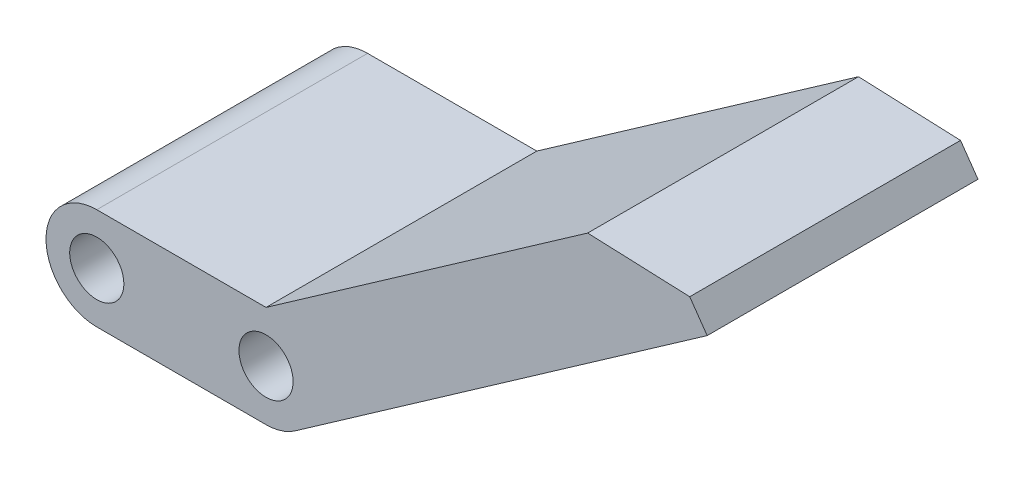
ISO-10303-21;
HEADER;
FILE_DESCRIPTION(('STEP AP214'),'2;1');
FILE_NAME('part.step','',(''),(''),'','','');
FILE_SCHEMA(('AUTOMOTIVE_DESIGN { 1 0 10303 214 1 1 1 1 }'));
ENDSEC;
DATA;
#1=APPLICATION_CONTEXT('core data for automotive mechanical design processes');
#2=APPLICATION_PROTOCOL_DEFINITION('international standard','automotive_design',2000,#1);
#3=PRODUCT_CONTEXT('',#1,'mechanical');
#4=PRODUCT('Part','Part','',(#3));
#5=PRODUCT_RELATED_PRODUCT_CATEGORY('part','',(#4));
#6=PRODUCT_DEFINITION_FORMATION('','',#4);
#7=PRODUCT_DEFINITION_CONTEXT('part definition',#1,'design');
#8=PRODUCT_DEFINITION('design','',#6,#7);
#9=PRODUCT_DEFINITION_SHAPE('','',#8);
#10=(LENGTH_UNIT() NAMED_UNIT(*) SI_UNIT(.MILLI.,.METRE.));
#11=(NAMED_UNIT(*) PLANE_ANGLE_UNIT() SI_UNIT($,.RADIAN.));
#12=(NAMED_UNIT(*) SI_UNIT($,.STERADIAN.) SOLID_ANGLE_UNIT());
#13=UNCERTAINTY_MEASURE_WITH_UNIT(LENGTH_MEASURE(1.E-05),#10,'distance_accuracy_value','');
#14=(GEOMETRIC_REPRESENTATION_CONTEXT(3) GLOBAL_UNCERTAINTY_ASSIGNED_CONTEXT((#13)) GLOBAL_UNIT_ASSIGNED_CONTEXT((#10,
#11,#12)) REPRESENTATION_CONTEXT('',''));
#15=CARTESIAN_POINT('',(0.,0.,0.));
#16=DIRECTION('',(0.,0.,1.));
#17=DIRECTION('',(1.,0.,0.));
#18=AXIS2_PLACEMENT_3D('',#15,#16,#17);
#19=CARTESIAN_POINT('',(0.,-7.5,40.));
#20=DIRECTION('',(0.,1.,0.));
#21=DIRECTION('',(-1.,0.,0.));
#22=AXIS2_PLACEMENT_3D('',#19,#20,#21);
#23=PLANE('',#22);
#24=DIRECTION('',(1.,0.,0.));
#25=VECTOR('',#24,1.);
#26=CARTESIAN_POINT('',(0.,-7.5,0.));
#27=LINE('',#26,#25);
#28=CARTESIAN_POINT('',(0.,-7.5,0.));
#29=VERTEX_POINT('',#28);
#30=CARTESIAN_POINT('',(25.,-7.5,0.));
#31=VERTEX_POINT('',#30);
#32=EDGE_CURVE('E143',#29,#31,#27,.T.);
#33=ORIENTED_EDGE('',*,*,#32,.T.);
#34=DIRECTION('',(0.,0.,-1.));
#35=VECTOR('',#34,1.);
#36=CARTESIAN_POINT('',(25.,-7.5,40.));
#37=LINE('',#36,#35);
#38=CARTESIAN_POINT('',(25.,-7.5,40.));
#39=VERTEX_POINT('',#38);
#40=EDGE_CURVE('E11',#39,#31,#37,.T.);
#41=ORIENTED_EDGE('',*,*,#40,.F.);
#42=DIRECTION('',(1.,0.,0.));
#43=VECTOR('',#42,1.);
#44=CARTESIAN_POINT('',(0.,-7.5,40.));
#45=LINE('',#44,#43);
#46=CARTESIAN_POINT('',(0.,-7.5,40.));
#47=VERTEX_POINT('',#46);
#48=EDGE_CURVE('E188',#47,#39,#45,.T.);
#49=ORIENTED_EDGE('',*,*,#48,.F.);
#50=DIRECTION('',(0.,0.,-1.));
#51=VECTOR('',#50,1.);
#52=CARTESIAN_POINT('',(0.,-7.5,40.));
#53=LINE('',#52,#51);
#54=EDGE_CURVE('E133',#47,#29,#53,.T.);
#55=ORIENTED_EDGE('',*,*,#54,.T.);
#56=EDGE_LOOP('',(#33,#41,#49,#55));
#57=FACE_BOUND('',#56,.T.);
#58=ADVANCED_FACE('F41',(#57),#23,.F.);
#59=CARTESIAN_POINT('',(25.,0.,40.));
#60=DIRECTION('',(0.,0.,-1.));
#61=DIRECTION('',(-1.,0.,0.));
#62=AXIS2_PLACEMENT_3D('',#59,#60,#61);
#63=CYLINDRICAL_SURFACE('',#62,7.5);
#64=CARTESIAN_POINT('',(25.,0.,0.));
#65=DIRECTION('',(0.,0.,1.));
#66=DIRECTION('',(1.,0.,0.));
#67=AXIS2_PLACEMENT_3D('',#64,#65,#66);
#68=CIRCLE('',#67,7.5);
#69=CARTESIAN_POINT('',(29.3018232726329,-6.14364033216744,0.));
#70=VERTEX_POINT('',#69);
#71=EDGE_CURVE('E146',#31,#70,#68,.T.);
#72=ORIENTED_EDGE('',*,*,#71,.T.);
#73=DIRECTION('',(0.,0.,-1.));
#74=VECTOR('',#73,1.);
#75=CARTESIAN_POINT('',(29.3018232726329,-6.14364033216744,40.));
#76=LINE('',#75,#74);
#77=CARTESIAN_POINT('',(29.3018232726329,-6.14364033216744,40.));
#78=VERTEX_POINT('',#77);
#79=EDGE_CURVE('E50',#78,#70,#76,.T.);
#80=ORIENTED_EDGE('',*,*,#79,.F.);
#81=CARTESIAN_POINT('',(25.,0.,40.));
#82=DIRECTION('',(0.,0.,1.));
#83=DIRECTION('',(1.,0.,0.));
#84=AXIS2_PLACEMENT_3D('',#81,#82,#83);
#85=CIRCLE('',#84,7.5);
#86=EDGE_CURVE('E97',#39,#78,#85,.T.);
#87=ORIENTED_EDGE('',*,*,#86,.F.);
#88=ORIENTED_EDGE('',*,*,#40,.T.);
#89=EDGE_LOOP('',(#72,#80,#87,#88));
#90=FACE_BOUND('',#89,.T.);
#91=ADVANCED_FACE('F175',(#90),#63,.T.);
#92=CARTESIAN_POINT('',(12.526571481062,-17.8897980919913,40.));
#93=DIRECTION('',(0.573576436351047,-0.819152044288991,0.));
#94=DIRECTION('',(0.819152044288991,0.573576436351047,0.));
#95=AXIS2_PLACEMENT_3D('',#92,#93,#94);
#96=PLANE('',#95);
#97=DIRECTION('',(-0.819152044288991,-0.573576436351047,0.));
#98=VECTOR('',#97,1.);
#99=CARTESIAN_POINT('',(12.526571481062,-17.8897980919913,0.));
#100=LINE('',#99,#98);
#101=CARTESIAN_POINT('',(90.1663137008094,36.4741346749346,0.));
#102=VERTEX_POINT('',#101);
#103=EDGE_CURVE('E149',#102,#70,#100,.T.);
#104=ORIENTED_EDGE('',*,*,#103,.F.);
#105=DIRECTION('',(0.,0.,-1.));
#106=VECTOR('',#105,1.);
#107=CARTESIAN_POINT('',(90.1663137008094,36.4741346749346,40.));
#108=LINE('',#107,#106);
#109=CARTESIAN_POINT('',(90.1663137008094,36.4741346749346,40.));
#110=VERTEX_POINT('',#109);
#111=EDGE_CURVE('E168',#110,#102,#108,.T.);
#112=ORIENTED_EDGE('',*,*,#111,.F.);
#113=DIRECTION('',(-0.819152044288991,-0.573576436351047,0.));
#114=VECTOR('',#113,1.);
#115=CARTESIAN_POINT('',(12.526571481062,-17.8897980919913,40.));
#116=LINE('',#115,#114);
#117=EDGE_CURVE('E174',#110,#78,#116,.T.);
#118=ORIENTED_EDGE('',*,*,#117,.T.);
#119=ORIENTED_EDGE('',*,*,#79,.T.);
#120=EDGE_LOOP('',(#104,#112,#118,#119));
#121=FACE_BOUND('',#120,.T.);
#122=ADVANCED_FACE('F172',(#121),#96,.T.);
#123=CARTESIAN_POINT('',(77.6397422197469,54.3639327669264,40.));
#124=DIRECTION('',(0.819152044288987,0.573576436351053,0.));
#125=DIRECTION('',(-0.573576436351053,0.819152044288987,0.));
#126=AXIS2_PLACEMENT_3D('',#123,#124,#125);
#127=PLANE('',#126);
#128=DIRECTION('',(0.573576436351053,-0.819152044288987,0.));
#129=VECTOR('',#128,1.);
#130=CARTESIAN_POINT('',(77.6397422197469,54.3639327669264,0.));
#131=LINE('',#130,#129);
#132=CARTESIAN_POINT('',(87.5852197372297,40.1603188742351,0.));
#133=VERTEX_POINT('',#132);
#134=EDGE_CURVE('E152',#133,#102,#131,.T.);
#135=ORIENTED_EDGE('',*,*,#134,.F.);
#136=DIRECTION('',(0.,0.,-1.));
#137=VECTOR('',#136,1.);
#138=CARTESIAN_POINT('',(87.5852197372297,40.1603188742351,40.));
#139=LINE('',#138,#137);
#140=CARTESIAN_POINT('',(87.5852197372297,40.1603188742351,40.));
#141=VERTEX_POINT('',#140);
#142=EDGE_CURVE('E166',#141,#133,#139,.T.);
#143=ORIENTED_EDGE('',*,*,#142,.F.);
#144=DIRECTION('',(0.573576436351053,-0.819152044288987,0.));
#145=VECTOR('',#144,1.);
#146=CARTESIAN_POINT('',(77.6397422197469,54.3639327669264,40.));
#147=LINE('',#146,#145);
#148=EDGE_CURVE('E185',#141,#110,#147,.T.);
#149=ORIENTED_EDGE('',*,*,#148,.T.);
#150=ORIENTED_EDGE('',*,*,#111,.T.);
#151=EDGE_LOOP('',(#135,#143,#149,#150));
#152=FACE_BOUND('',#151,.T.);
#153=ADVANCED_FACE('F183',(#152),#127,.T.);
#154=CARTESIAN_POINT('',(1.75665517806809,43.6170240409483,40.));
#155=DIRECTION('',(0.0402419070743514,0.999189966380277,0.));
#156=DIRECTION('',(-0.999189966380277,0.0402419070743514,0.));
#157=AXIS2_PLACEMENT_3D('',#154,#155,#156);
#158=PLANE('',#157);
#159=DIRECTION('',(0.999189966380277,-0.0402419070743514,0.));
#160=VECTOR('',#159,1.);
#161=CARTESIAN_POINT('',(1.75665517806809,43.6170240409483,0.));
#162=LINE('',#161,#160);
#163=CARTESIAN_POINT('',(72.5108185687615,40.7674333083607,0.));
#164=VERTEX_POINT('',#163);
#165=EDGE_CURVE('E155',#164,#133,#162,.T.);
#166=ORIENTED_EDGE('',*,*,#165,.F.);
#167=DIRECTION('',(0.,0.,-1.));
#168=VECTOR('',#167,1.);
#169=CARTESIAN_POINT('',(72.5108185687615,40.7674333083607,40.));
#170=LINE('',#169,#168);
#171=CARTESIAN_POINT('',(72.5108185687615,40.7674333083607,40.));
#172=VERTEX_POINT('',#171);
#173=EDGE_CURVE('E122',#172,#164,#170,.T.);
#174=ORIENTED_EDGE('',*,*,#173,.F.);
#175=DIRECTION('',(0.999189966380277,-0.0402419070743514,0.));
#176=VECTOR('',#175,1.);
#177=CARTESIAN_POINT('',(1.75665517806809,43.6170240409483,40.));
#178=LINE('',#177,#176);
#179=EDGE_CURVE('E129',#172,#141,#178,.T.);
#180=ORIENTED_EDGE('',*,*,#179,.T.);
#181=ORIENTED_EDGE('',*,*,#142,.T.);
#182=EDGE_LOOP('',(#166,#174,#180,#181));
#183=FACE_BOUND('',#182,.T.);
#184=ADVANCED_FACE('F192',(#183),#158,.T.);
#185=CARTESIAN_POINT('',(4.70090088048201,-6.71358222235262,40.));
#186=DIRECTION('',(-0.573576436351047,0.819152044288991,0.));
#187=DIRECTION('',(-0.819152044288991,-0.573576436351047,0.));
#188=AXIS2_PLACEMENT_3D('',#185,#186,#187);
#189=PLANE('',#188);
#190=DIRECTION('',(0.819152044288991,0.573576436351047,0.));
#191=VECTOR('',#190,1.);
#192=CARTESIAN_POINT('',(4.70090088048201,-6.71358222235262,0.));
#193=LINE('',#192,#191);
#194=CARTESIAN_POINT('',(25.,7.5,0.));
#195=VERTEX_POINT('',#194);
#196=EDGE_CURVE('E117',#195,#164,#193,.T.);
#197=ORIENTED_EDGE('',*,*,#196,.F.);
#198=DIRECTION('',(0.,0.,-1.));
#199=VECTOR('',#198,1.);
#200=CARTESIAN_POINT('',(25.,7.5,40.));
#201=LINE('',#200,#199);
#202=CARTESIAN_POINT('',(25.,7.5,40.));
#203=VERTEX_POINT('',#202);
#204=EDGE_CURVE('E112',#203,#195,#201,.T.);
#205=ORIENTED_EDGE('',*,*,#204,.F.);
#206=DIRECTION('',(0.819152044288991,0.573576436351047,0.));
#207=VECTOR('',#206,1.);
#208=CARTESIAN_POINT('',(4.70090088048201,-6.71358222235262,40.));
#209=LINE('',#208,#207);
#210=EDGE_CURVE('E115',#203,#172,#209,.T.);
#211=ORIENTED_EDGE('',*,*,#210,.T.);
#212=ORIENTED_EDGE('',*,*,#173,.T.);
#213=EDGE_LOOP('',(#197,#205,#211,#212));
#214=FACE_BOUND('',#213,.T.);
#215=ADVANCED_FACE('F114',(#214),#189,.T.);
#216=CARTESIAN_POINT('',(0.,7.5,40.));
#217=DIRECTION('',(0.,1.,0.));
#218=DIRECTION('',(-1.,0.,0.));
#219=AXIS2_PLACEMENT_3D('',#216,#217,#218);
#220=PLANE('',#219);
#221=DIRECTION('',(1.,0.,0.));
#222=VECTOR('',#221,1.);
#223=CARTESIAN_POINT('',(0.,7.5,0.));
#224=LINE('',#223,#222);
#225=CARTESIAN_POINT('',(0.,7.5,0.));
#226=VERTEX_POINT('',#225);
#227=EDGE_CURVE('E159',#226,#195,#224,.T.);
#228=ORIENTED_EDGE('',*,*,#227,.F.);
#229=DIRECTION('',(0.,0.,-1.));
#230=VECTOR('',#229,1.);
#231=CARTESIAN_POINT('',(0.,7.5,40.));
#232=LINE('',#231,#230);
#233=CARTESIAN_POINT('',(0.,7.5,40.));
#234=VERTEX_POINT('',#233);
#235=EDGE_CURVE('E86',#234,#226,#232,.T.);
#236=ORIENTED_EDGE('',*,*,#235,.F.);
#237=DIRECTION('',(1.,0.,0.));
#238=VECTOR('',#237,1.);
#239=CARTESIAN_POINT('',(0.,7.5,40.));
#240=LINE('',#239,#238);
#241=EDGE_CURVE('E126',#234,#203,#240,.T.);
#242=ORIENTED_EDGE('',*,*,#241,.T.);
#243=ORIENTED_EDGE('',*,*,#204,.T.);
#244=EDGE_LOOP('',(#228,#236,#242,#243));
#245=FACE_BOUND('',#244,.T.);
#246=ADVANCED_FACE('F131',(#245),#220,.T.);
#247=CARTESIAN_POINT('',(0.,0.,40.));
#248=DIRECTION('',(0.,0.,-1.));
#249=DIRECTION('',(-1.,0.,0.));
#250=AXIS2_PLACEMENT_3D('',#247,#248,#249);
#251=CYLINDRICAL_SURFACE('',#250,4.);
#252=CARTESIAN_POINT('',(0.,0.,40.));
#253=DIRECTION('',(0.,0.,1.));
#254=DIRECTION('',(1.,0.,0.));
#255=AXIS2_PLACEMENT_3D('',#252,#253,#254);
#256=CIRCLE('',#255,4.);
#257=CARTESIAN_POINT('',(4.,0.,40.));
#258=VERTEX_POINT('',#257);
#259=EDGE_CURVE('E223',#258,#258,#256,.T.);
#260=ORIENTED_EDGE('',*,*,#259,.T.);
#261=EDGE_LOOP('',(#260));
#262=FACE_BOUND('',#261,.T.);
#263=CARTESIAN_POINT('',(0.,0.,0.));
#264=DIRECTION('',(0.,0.,1.));
#265=DIRECTION('',(1.,0.,0.));
#266=AXIS2_PLACEMENT_3D('',#263,#264,#265);
#267=CIRCLE('',#266,4.);
#268=CARTESIAN_POINT('',(4.,0.,0.));
#269=VERTEX_POINT('',#268);
#270=EDGE_CURVE('E140',#269,#269,#267,.T.);
#271=ORIENTED_EDGE('',*,*,#270,.F.);
#272=EDGE_LOOP('',(#271));
#273=FACE_BOUND('',#272,.T.);
#274=ADVANCED_FACE('F204',(#262,#273),#251,.F.);
#275=CARTESIAN_POINT('',(25.,0.,40.));
#276=DIRECTION('',(0.,0.,-1.));
#277=DIRECTION('',(-1.,0.,0.));
#278=AXIS2_PLACEMENT_3D('',#275,#276,#277);
#279=CYLINDRICAL_SURFACE('',#278,4.00000000000001);
#280=CARTESIAN_POINT('',(25.,0.,40.));
#281=DIRECTION('',(0.,0.,1.));
#282=DIRECTION('',(1.,0.,0.));
#283=AXIS2_PLACEMENT_3D('',#280,#281,#282);
#284=CIRCLE('',#283,4.00000000000001);
#285=CARTESIAN_POINT('',(29.,0.,40.));
#286=VERTEX_POINT('',#285);
#287=EDGE_CURVE('E162',#286,#286,#284,.T.);
#288=ORIENTED_EDGE('',*,*,#287,.T.);
#289=EDGE_LOOP('',(#288));
#290=FACE_BOUND('',#289,.T.);
#291=CARTESIAN_POINT('',(25.,0.,0.));
#292=DIRECTION('',(0.,0.,1.));
#293=DIRECTION('',(1.,0.,0.));
#294=AXIS2_PLACEMENT_3D('',#291,#292,#293);
#295=CIRCLE('',#294,4.00000000000001);
#296=CARTESIAN_POINT('',(29.,0.,0.));
#297=VERTEX_POINT('',#296);
#298=EDGE_CURVE('E137',#297,#297,#295,.T.);
#299=ORIENTED_EDGE('',*,*,#298,.F.);
#300=EDGE_LOOP('',(#299));
#301=FACE_BOUND('',#300,.T.);
#302=ADVANCED_FACE('F43',(#290,#301),#279,.F.);
#303=CARTESIAN_POINT('',(0.,0.,40.));
#304=DIRECTION('',(0.,0.,-1.));
#305=DIRECTION('',(-1.,0.,0.));
#306=AXIS2_PLACEMENT_3D('',#303,#304,#305);
#307=CYLINDRICAL_SURFACE('',#306,7.5);
#308=CARTESIAN_POINT('',(0.,0.,0.));
#309=DIRECTION('',(0.,0.,1.));
#310=DIRECTION('',(1.,0.,0.));
#311=AXIS2_PLACEMENT_3D('',#308,#309,#310);
#312=CIRCLE('',#311,7.5);
#313=EDGE_CURVE('E89',#226,#29,#312,.T.);
#314=ORIENTED_EDGE('',*,*,#313,.T.);
#315=ORIENTED_EDGE('',*,*,#54,.F.);
#316=CARTESIAN_POINT('',(0.,0.,40.));
#317=DIRECTION('',(0.,0.,1.));
#318=DIRECTION('',(1.,0.,0.));
#319=AXIS2_PLACEMENT_3D('',#316,#317,#318);
#320=CIRCLE('',#319,7.5);
#321=EDGE_CURVE('E58',#234,#47,#320,.T.);
#322=ORIENTED_EDGE('',*,*,#321,.F.);
#323=ORIENTED_EDGE('',*,*,#235,.T.);
#324=EDGE_LOOP('',(#314,#315,#322,#323));
#325=FACE_BOUND('',#324,.T.);
#326=ADVANCED_FACE('F195',(#325),#307,.T.);
#327=CARTESIAN_POINT('',(0.,0.,40.));
#328=DIRECTION('',(0.,0.,1.));
#329=DIRECTION('',(1.,0.,0.));
#330=AXIS2_PLACEMENT_3D('',#327,#328,#329);
#331=PLANE('',#330);
#332=ORIENTED_EDGE('',*,*,#287,.F.);
#333=EDGE_LOOP('',(#332));
#334=FACE_BOUND('',#333,.T.);
#335=ORIENTED_EDGE('',*,*,#259,.F.);
#336=EDGE_LOOP('',(#335));
#337=FACE_BOUND('',#336,.T.);
#338=ORIENTED_EDGE('',*,*,#48,.T.);
#339=ORIENTED_EDGE('',*,*,#86,.T.);
#340=ORIENTED_EDGE('',*,*,#117,.F.);
#341=ORIENTED_EDGE('',*,*,#148,.F.);
#342=ORIENTED_EDGE('',*,*,#179,.F.);
#343=ORIENTED_EDGE('',*,*,#210,.F.);
#344=ORIENTED_EDGE('',*,*,#241,.F.);
#345=ORIENTED_EDGE('',*,*,#321,.T.);
#346=EDGE_LOOP('',(#338,#339,#340,#341,#342,#343,#344,#345));
#347=FACE_BOUND('',#346,.T.);
#348=ADVANCED_FACE('F125',(#334,#337,#347),#331,.T.);
#349=CARTESIAN_POINT('',(0.,0.,0.));
#350=DIRECTION('',(0.,0.,1.));
#351=DIRECTION('',(1.,0.,0.));
#352=AXIS2_PLACEMENT_3D('',#349,#350,#351);
#353=PLANE('',#352);
#354=ORIENTED_EDGE('',*,*,#298,.T.);
#355=EDGE_LOOP('',(#354));
#356=FACE_BOUND('',#355,.T.);
#357=ORIENTED_EDGE('',*,*,#270,.T.);
#358=EDGE_LOOP('',(#357));
#359=FACE_BOUND('',#358,.T.);
#360=ORIENTED_EDGE('',*,*,#32,.F.);
#361=ORIENTED_EDGE('',*,*,#313,.F.);
#362=ORIENTED_EDGE('',*,*,#227,.T.);
#363=ORIENTED_EDGE('',*,*,#196,.T.);
#364=ORIENTED_EDGE('',*,*,#165,.T.);
#365=ORIENTED_EDGE('',*,*,#134,.T.);
#366=ORIENTED_EDGE('',*,*,#103,.T.);
#367=ORIENTED_EDGE('',*,*,#71,.F.);
#368=EDGE_LOOP('',(#360,#361,#362,#363,#364,#365,#366,#367));
#369=FACE_BOUND('',#368,.T.);
#370=ADVANCED_FACE('F179',(#356,#359,#369),#353,.F.);
#371=CLOSED_SHELL('',(#58,#91,#122,#153,#184,#215,#246,#274,#302,#326,#348,#370));
#372=MANIFOLD_SOLID_BREP('B2',#371);
#373=ADVANCED_BREP_SHAPE_REPRESENTATION('',(#18,#372),#14);
#374=SHAPE_DEFINITION_REPRESENTATION(#9,#373);
ENDSEC;
END-ISO-10303-21;
